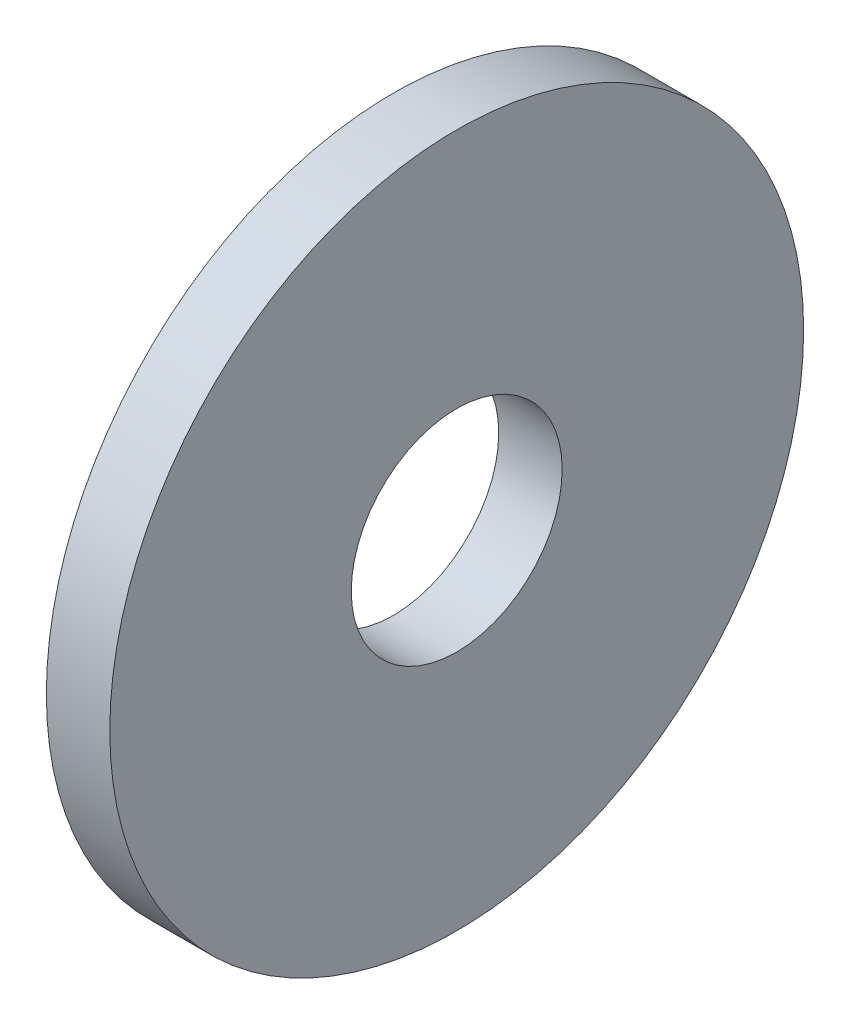
ISO-10303-21;
HEADER;
FILE_DESCRIPTION(('STEP AP214'),'2;1');
FILE_NAME('part.step','',(''),(''),'','','');
FILE_SCHEMA(('AUTOMOTIVE_DESIGN { 1 0 10303 214 1 1 1 1 }'));
ENDSEC;
DATA;
#1=APPLICATION_CONTEXT('core data for automotive mechanical design processes');
#2=APPLICATION_PROTOCOL_DEFINITION('international standard','automotive_design',2000,#1);
#3=PRODUCT_CONTEXT('',#1,'mechanical');
#4=PRODUCT('Part','Part','',(#3));
#5=PRODUCT_RELATED_PRODUCT_CATEGORY('part','',(#4));
#6=PRODUCT_DEFINITION_FORMATION('','',#4);
#7=PRODUCT_DEFINITION_CONTEXT('part definition',#1,'design');
#8=PRODUCT_DEFINITION('design','',#6,#7);
#9=PRODUCT_DEFINITION_SHAPE('','',#8);
#10=(LENGTH_UNIT() NAMED_UNIT(*) SI_UNIT(.MILLI.,.METRE.));
#11=(NAMED_UNIT(*) PLANE_ANGLE_UNIT() SI_UNIT($,.RADIAN.));
#12=(NAMED_UNIT(*) SI_UNIT($,.STERADIAN.) SOLID_ANGLE_UNIT());
#13=UNCERTAINTY_MEASURE_WITH_UNIT(LENGTH_MEASURE(1.E-05),#10,'distance_accuracy_value','');
#14=(GEOMETRIC_REPRESENTATION_CONTEXT(3) GLOBAL_UNCERTAINTY_ASSIGNED_CONTEXT((#13)) GLOBAL_UNIT_ASSIGNED_CONTEXT((#10,
#11,#12)) REPRESENTATION_CONTEXT('',''));
#15=CARTESIAN_POINT('',(0.,0.,0.));
#16=DIRECTION('',(0.,0.,1.));
#17=DIRECTION('',(1.,0.,0.));
#18=AXIS2_PLACEMENT_3D('',#15,#16,#17);
#19=CARTESIAN_POINT('',(2.032,0.,0.));
#20=DIRECTION('',(1.,0.,0.));
#21=DIRECTION('',(0.,0.,-1.));
#22=AXIS2_PLACEMENT_3D('',#19,#20,#21);
#23=PLANE('',#22);
#24=CARTESIAN_POINT('',(2.032,0.,0.));
#25=DIRECTION('',(1.,0.,0.));
#26=DIRECTION('',(0.,0.,-1.));
#27=AXIS2_PLACEMENT_3D('',#24,#25,#26);
#28=CIRCLE('',#27,11.1125);
#29=CARTESIAN_POINT('',(2.032,0.,-11.1125));
#30=VERTEX_POINT('',#29);
#31=EDGE_CURVE('E10',#30,#30,#28,.T.);
#32=ORIENTED_EDGE('',*,*,#31,.T.);
#33=EDGE_LOOP('',(#32));
#34=FACE_BOUND('',#33,.T.);
#35=CARTESIAN_POINT('',(2.032,0.,0.));
#36=DIRECTION('',(1.,0.,0.));
#37=DIRECTION('',(0.,0.,-1.));
#38=AXIS2_PLACEMENT_3D('',#35,#36,#37);
#39=CIRCLE('',#38,3.3782);
#40=CARTESIAN_POINT('',(2.032,0.,-3.3782));
#41=VERTEX_POINT('',#40);
#42=EDGE_CURVE('E43',#41,#41,#39,.T.);
#43=ORIENTED_EDGE('',*,*,#42,.F.);
#44=EDGE_LOOP('',(#43));
#45=FACE_BOUND('',#44,.T.);
#46=ADVANCED_FACE('F32',(#34,#45),#23,.T.);
#47=CARTESIAN_POINT('',(0.,0.,0.));
#48=DIRECTION('',(1.,0.,0.));
#49=DIRECTION('',(0.,0.,-1.));
#50=AXIS2_PLACEMENT_3D('',#47,#48,#49);
#51=PLANE('',#50);
#52=CARTESIAN_POINT('',(0.,0.,0.));
#53=DIRECTION('',(1.,0.,0.));
#54=DIRECTION('',(0.,0.,-1.));
#55=AXIS2_PLACEMENT_3D('',#52,#53,#54);
#56=CIRCLE('',#55,11.1125);
#57=CARTESIAN_POINT('',(0.,0.,-11.1125));
#58=VERTEX_POINT('',#57);
#59=EDGE_CURVE('E36',#58,#58,#56,.T.);
#60=ORIENTED_EDGE('',*,*,#59,.F.);
#61=EDGE_LOOP('',(#60));
#62=FACE_BOUND('',#61,.T.);
#63=CARTESIAN_POINT('',(0.,0.,0.));
#64=DIRECTION('',(1.,0.,0.));
#65=DIRECTION('',(0.,0.,-1.));
#66=AXIS2_PLACEMENT_3D('',#63,#64,#65);
#67=CIRCLE('',#66,3.3782);
#68=CARTESIAN_POINT('',(0.,0.,-3.3782));
#69=VERTEX_POINT('',#68);
#70=EDGE_CURVE('E45',#69,#69,#67,.T.);
#71=ORIENTED_EDGE('',*,*,#70,.T.);
#72=EDGE_LOOP('',(#71));
#73=FACE_BOUND('',#72,.T.);
#74=ADVANCED_FACE('F55',(#62,#73),#51,.F.);
#75=CARTESIAN_POINT('',(2.032,0.,0.));
#76=DIRECTION('',(-1.,0.,0.));
#77=DIRECTION('',(0.,0.,1.));
#78=AXIS2_PLACEMENT_3D('',#75,#76,#77);
#79=CYLINDRICAL_SURFACE('',#78,11.1125);
#80=ORIENTED_EDGE('',*,*,#31,.F.);
#81=EDGE_LOOP('',(#80));
#82=FACE_BOUND('',#81,.T.);
#83=ORIENTED_EDGE('',*,*,#59,.T.);
#84=EDGE_LOOP('',(#83));
#85=FACE_BOUND('',#84,.T.);
#86=ADVANCED_FACE('F34',(#82,#85),#79,.T.);
#87=CARTESIAN_POINT('',(2.032,0.,0.));
#88=DIRECTION('',(-1.,0.,0.));
#89=DIRECTION('',(0.,0.,1.));
#90=AXIS2_PLACEMENT_3D('',#87,#88,#89);
#91=CYLINDRICAL_SURFACE('',#90,3.3782);
#92=ORIENTED_EDGE('',*,*,#42,.T.);
#93=EDGE_LOOP('',(#92));
#94=FACE_BOUND('',#93,.T.);
#95=ORIENTED_EDGE('',*,*,#70,.F.);
#96=EDGE_LOOP('',(#95));
#97=FACE_BOUND('',#96,.T.);
#98=ADVANCED_FACE('F51',(#94,#97),#91,.F.);
#99=CLOSED_SHELL('',(#46,#74,#86,#98));
#100=MANIFOLD_SOLID_BREP('B2',#99);
#101=ADVANCED_BREP_SHAPE_REPRESENTATION('',(#18,#100),#14);
#102=SHAPE_DEFINITION_REPRESENTATION(#9,#101);
ENDSEC;
END-ISO-10303-21;
